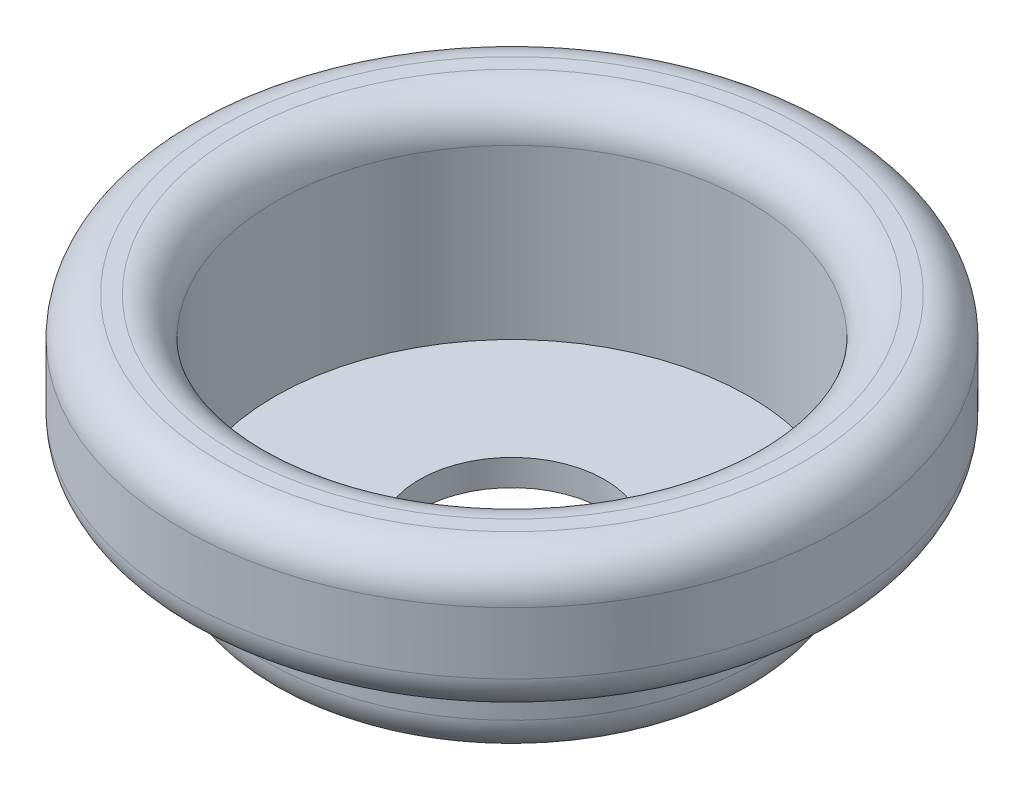
ISO-10303-21;
HEADER;
FILE_DESCRIPTION(('STEP AP214'),'2;1');
FILE_NAME('part.step','',(''),(''),'','','');
FILE_SCHEMA(('AUTOMOTIVE_DESIGN { 1 0 10303 214 1 1 1 1 }'));
ENDSEC;
DATA;
#1=APPLICATION_CONTEXT('core data for automotive mechanical design processes');
#2=APPLICATION_PROTOCOL_DEFINITION('international standard','automotive_design',2000,#1);
#3=PRODUCT_CONTEXT('',#1,'mechanical');
#4=PRODUCT('Part','Part','',(#3));
#5=PRODUCT_RELATED_PRODUCT_CATEGORY('part','',(#4));
#6=PRODUCT_DEFINITION_FORMATION('','',#4);
#7=PRODUCT_DEFINITION_CONTEXT('part definition',#1,'design');
#8=PRODUCT_DEFINITION('design','',#6,#7);
#9=PRODUCT_DEFINITION_SHAPE('','',#8);
#10=(LENGTH_UNIT() NAMED_UNIT(*) SI_UNIT(.MILLI.,.METRE.));
#11=(NAMED_UNIT(*) PLANE_ANGLE_UNIT() SI_UNIT($,.RADIAN.));
#12=(NAMED_UNIT(*) SI_UNIT($,.STERADIAN.) SOLID_ANGLE_UNIT());
#13=UNCERTAINTY_MEASURE_WITH_UNIT(LENGTH_MEASURE(1.E-05),#10,'distance_accuracy_value','');
#14=(GEOMETRIC_REPRESENTATION_CONTEXT(3) GLOBAL_UNCERTAINTY_ASSIGNED_CONTEXT((#13)) GLOBAL_UNIT_ASSIGNED_CONTEXT((#10,
#11,#12)) REPRESENTATION_CONTEXT('',''));
#15=CARTESIAN_POINT('',(0.,0.,0.));
#16=DIRECTION('',(0.,0.,1.));
#17=DIRECTION('',(1.,0.,0.));
#18=AXIS2_PLACEMENT_3D('',#15,#16,#17);
#19=CARTESIAN_POINT('',(0.,0.,0.));
#20=DIRECTION('',(0.,-1.,0.));
#21=DIRECTION('',(0.,0.,-1.));
#22=AXIS2_PLACEMENT_3D('',#19,#20,#21);
#23=CYLINDRICAL_SURFACE('',#22,4.064);
#24=CARTESIAN_POINT('',(0.,0.635,0.));
#25=DIRECTION('',(0.,1.,0.));
#26=DIRECTION('',(0.,0.,1.));
#27=AXIS2_PLACEMENT_3D('',#24,#25,#26);
#28=CIRCLE('',#27,4.064);
#29=CARTESIAN_POINT('',(0.,0.635,4.064));
#30=VERTEX_POINT('',#29);
#31=EDGE_CURVE('E59',#30,#30,#28,.T.);
#32=ORIENTED_EDGE('',*,*,#31,.T.);
#33=EDGE_LOOP('',(#32));
#34=FACE_BOUND('',#33,.T.);
#35=CARTESIAN_POINT('',(0.,0.914399999999999,0.));
#36=DIRECTION('',(0.,1.,0.));
#37=DIRECTION('',(0.,0.,1.));
#38=AXIS2_PLACEMENT_3D('',#35,#36,#37);
#39=CIRCLE('',#38,4.064);
#40=CARTESIAN_POINT('',(0.,0.914399999999999,4.064));
#41=VERTEX_POINT('',#40);
#42=EDGE_CURVE('E62',#41,#41,#39,.F.);
#43=ORIENTED_EDGE('',*,*,#42,.T.);
#44=EDGE_LOOP('',(#43));
#45=FACE_BOUND('',#44,.T.);
#46=ADVANCED_FACE('F30',(#34,#45),#23,.T.);
#47=CARTESIAN_POINT('',(-4.064,0.,0.));
#48=DIRECTION('',(0.,1.,0.));
#49=DIRECTION('',(0.,0.,1.));
#50=AXIS2_PLACEMENT_3D('',#47,#48,#49);
#51=PLANE('',#50);
#52=CARTESIAN_POINT('',(0.,0.,0.));
#53=DIRECTION('',(0.,1.,0.));
#54=DIRECTION('',(0.,0.,1.));
#55=AXIS2_PLACEMENT_3D('',#52,#53,#54);
#56=CIRCLE('',#55,3.429);
#57=CARTESIAN_POINT('',(0.,0.,3.429));
#58=VERTEX_POINT('',#57);
#59=EDGE_CURVE('E65',#58,#58,#56,.F.);
#60=ORIENTED_EDGE('',*,*,#59,.T.);
#61=EDGE_LOOP('',(#60));
#62=FACE_BOUND('',#61,.T.);
#63=CARTESIAN_POINT('',(0.,0.,0.));
#64=DIRECTION('',(0.,-1.,0.));
#65=DIRECTION('',(0.,0.,-1.));
#66=AXIS2_PLACEMENT_3D('',#63,#64,#65);
#67=CIRCLE('',#66,1.524);
#68=CARTESIAN_POINT('',(0.,0.,-1.524));
#69=VERTEX_POINT('',#68);
#70=EDGE_CURVE('E68',#69,#69,#67,.T.);
#71=ORIENTED_EDGE('',*,*,#70,.F.);
#72=EDGE_LOOP('',(#71));
#73=FACE_BOUND('',#72,.T.);
#74=ADVANCED_FACE('F89',(#62,#73),#51,.F.);
#75=CARTESIAN_POINT('',(0.,0.,0.));
#76=DIRECTION('',(0.,-1.,0.));
#77=DIRECTION('',(0.,0.,-1.));
#78=AXIS2_PLACEMENT_3D('',#75,#76,#77);
#79=CYLINDRICAL_SURFACE('',#78,1.524);
#80=CARTESIAN_POINT('',(0.,0.431799999999999,0.));
#81=DIRECTION('',(0.,-1.,0.));
#82=DIRECTION('',(0.,0.,-1.));
#83=AXIS2_PLACEMENT_3D('',#80,#81,#82);
#84=CIRCLE('',#83,1.524);
#85=CARTESIAN_POINT('',(0.,0.431799999999999,-1.524));
#86=VERTEX_POINT('',#85);
#87=EDGE_CURVE('E71',#86,#86,#84,.T.);
#88=ORIENTED_EDGE('',*,*,#87,.F.);
#89=EDGE_LOOP('',(#88));
#90=FACE_BOUND('',#89,.T.);
#91=ORIENTED_EDGE('',*,*,#70,.T.);
#92=EDGE_LOOP('',(#91));
#93=FACE_BOUND('',#92,.T.);
#94=ADVANCED_FACE('F83',(#90,#93),#79,.F.);
#95=CARTESIAN_POINT('',(-1.524,0.431799999999999,0.));
#96=DIRECTION('',(0.,-1.,0.));
#97=DIRECTION('',(0.,0.,-1.));
#98=AXIS2_PLACEMENT_3D('',#95,#96,#97);
#99=PLANE('',#98);
#100=CARTESIAN_POINT('',(0.,0.431799999999999,0.));
#101=DIRECTION('',(0.,-1.,0.));
#102=DIRECTION('',(0.,0.,-1.));
#103=AXIS2_PLACEMENT_3D('',#100,#101,#102);
#104=CIRCLE('',#103,3.8989);
#105=CARTESIAN_POINT('',(0.,0.431799999999999,-3.8989));
#106=VERTEX_POINT('',#105);
#107=EDGE_CURVE('E74',#106,#106,#104,.T.);
#108=ORIENTED_EDGE('',*,*,#107,.F.);
#109=EDGE_LOOP('',(#108));
#110=FACE_BOUND('',#109,.T.);
#111=ORIENTED_EDGE('',*,*,#87,.T.);
#112=EDGE_LOOP('',(#111));
#113=FACE_BOUND('',#112,.T.);
#114=ADVANCED_FACE('F80',(#110,#113),#99,.F.);
#115=CARTESIAN_POINT('',(0.,0.,0.));
#116=DIRECTION('',(0.,-1.,0.));
#117=DIRECTION('',(0.,0.,-1.));
#118=AXIS2_PLACEMENT_3D('',#115,#116,#117);
#119=CYLINDRICAL_SURFACE('',#118,3.8989);
#120=CARTESIAN_POINT('',(0.,3.2004,0.));
#121=DIRECTION('',(0.,-1.,0.));
#122=DIRECTION('',(0.,0.,-1.));
#123=AXIS2_PLACEMENT_3D('',#120,#121,#122);
#124=CIRCLE('',#123,3.8989);
#125=CARTESIAN_POINT('',(0.,3.2004,-3.8989));
#126=VERTEX_POINT('',#125);
#127=EDGE_CURVE('E10',#126,#126,#124,.F.);
#128=ORIENTED_EDGE('',*,*,#127,.T.);
#129=EDGE_LOOP('',(#128));
#130=FACE_BOUND('',#129,.T.);
#131=ORIENTED_EDGE('',*,*,#107,.T.);
#132=EDGE_LOOP('',(#131));
#133=FACE_BOUND('',#132,.T.);
#134=ADVANCED_FACE('F78',(#130,#133),#119,.F.);
#135=CARTESIAN_POINT('',(-3.8989,3.8354,0.));
#136=DIRECTION('',(0.,-1.,0.));
#137=DIRECTION('',(0.,0.,-1.));
#138=AXIS2_PLACEMENT_3D('',#135,#136,#137);
#139=PLANE('',#138);
#140=CARTESIAN_POINT('',(0.,3.8354,0.));
#141=DIRECTION('',(0.,-1.,0.));
#142=DIRECTION('',(0.,0.,-1.));
#143=AXIS2_PLACEMENT_3D('',#140,#141,#142);
#144=CIRCLE('',#143,4.7879);
#145=CARTESIAN_POINT('',(0.,3.8354,-4.7879));
#146=VERTEX_POINT('',#145);
#147=EDGE_CURVE('E37',#146,#146,#144,.F.);
#148=ORIENTED_EDGE('',*,*,#147,.T.);
#149=EDGE_LOOP('',(#148));
#150=FACE_BOUND('',#149,.T.);
#151=CARTESIAN_POINT('',(0.,3.8354,0.));
#152=DIRECTION('',(0.,-1.,0.));
#153=DIRECTION('',(0.,0.,-1.));
#154=AXIS2_PLACEMENT_3D('',#151,#152,#153);
#155=CIRCLE('',#154,4.5339);
#156=CARTESIAN_POINT('',(0.,3.8354,-4.5339));
#157=VERTEX_POINT('',#156);
#158=EDGE_CURVE('E41',#157,#157,#155,.T.);
#159=ORIENTED_EDGE('',*,*,#158,.T.);
#160=EDGE_LOOP('',(#159));
#161=FACE_BOUND('',#160,.T.);
#162=ADVANCED_FACE('F126',(#150,#161),#139,.F.);
#163=CARTESIAN_POINT('',(0.,0.,0.));
#164=DIRECTION('',(0.,-1.,0.));
#165=DIRECTION('',(0.,0.,-1.));
#166=AXIS2_PLACEMENT_3D('',#163,#164,#165);
#167=CYLINDRICAL_SURFACE('',#166,5.4229);
#168=CARTESIAN_POINT('',(0.,2.1844,0.));
#169=DIRECTION('',(0.,1.,0.));
#170=DIRECTION('',(0.,0.,1.));
#171=AXIS2_PLACEMENT_3D('',#168,#169,#170);
#172=CIRCLE('',#171,5.4229);
#173=CARTESIAN_POINT('',(0.,2.1844,5.4229));
#174=VERTEX_POINT('',#173);
#175=EDGE_CURVE('E45',#174,#174,#172,.T.);
#176=ORIENTED_EDGE('',*,*,#175,.T.);
#177=EDGE_LOOP('',(#176));
#178=FACE_BOUND('',#177,.T.);
#179=CARTESIAN_POINT('',(0.,3.2004,0.));
#180=DIRECTION('',(0.,-1.,0.));
#181=DIRECTION('',(0.,0.,-1.));
#182=AXIS2_PLACEMENT_3D('',#179,#180,#181);
#183=CIRCLE('',#182,5.4229);
#184=CARTESIAN_POINT('',(0.,3.2004,-5.4229));
#185=VERTEX_POINT('',#184);
#186=EDGE_CURVE('E50',#185,#185,#183,.T.);
#187=ORIENTED_EDGE('',*,*,#186,.T.);
#188=EDGE_LOOP('',(#187));
#189=FACE_BOUND('',#188,.T.);
#190=ADVANCED_FACE('F124',(#178,#189),#167,.T.);
#191=CARTESIAN_POINT('',(-5.4229,1.5494,0.));
#192=DIRECTION('',(0.,1.,0.));
#193=DIRECTION('',(0.,0.,1.));
#194=AXIS2_PLACEMENT_3D('',#191,#192,#193);
#195=PLANE('',#194);
#196=CARTESIAN_POINT('',(0.,1.5494,0.));
#197=DIRECTION('',(0.,1.,0.));
#198=DIRECTION('',(0.,0.,1.));
#199=AXIS2_PLACEMENT_3D('',#196,#197,#198);
#200=CIRCLE('',#199,4.699);
#201=CARTESIAN_POINT('',(0.,1.5494,4.699));
#202=VERTEX_POINT('',#201);
#203=EDGE_CURVE('E53',#202,#202,#200,.T.);
#204=ORIENTED_EDGE('',*,*,#203,.T.);
#205=EDGE_LOOP('',(#204));
#206=FACE_BOUND('',#205,.T.);
#207=CARTESIAN_POINT('',(0.,1.5494,0.));
#208=DIRECTION('',(0.,1.,0.));
#209=DIRECTION('',(0.,0.,1.));
#210=AXIS2_PLACEMENT_3D('',#207,#208,#209);
#211=CIRCLE('',#210,4.7879);
#212=CARTESIAN_POINT('',(0.,1.5494,4.7879));
#213=VERTEX_POINT('',#212);
#214=EDGE_CURVE('E56',#213,#213,#211,.F.);
#215=ORIENTED_EDGE('',*,*,#214,.T.);
#216=EDGE_LOOP('',(#215));
#217=FACE_BOUND('',#216,.T.);
#218=ADVANCED_FACE('F106',(#206,#217),#195,.F.);
#219=CARTESIAN_POINT('',(0.,0.635,0.));
#220=DIRECTION('',(0.,1.,0.));
#221=DIRECTION('',(0.,0.,1.));
#222=AXIS2_PLACEMENT_3D('',#219,#220,#221);
#223=TOROIDAL_SURFACE('',#222,3.429,0.635);
#224=ORIENTED_EDGE('',*,*,#31,.F.);
#225=EDGE_LOOP('',(#224));
#226=FACE_BOUND('',#225,.T.);
#227=ORIENTED_EDGE('',*,*,#59,.F.);
#228=EDGE_LOOP('',(#227));
#229=FACE_BOUND('',#228,.T.);
#230=ADVANCED_FACE('F102',(#226,#229),#223,.T.);
#231=CARTESIAN_POINT('',(0.,0.914399999999999,0.));
#232=DIRECTION('',(0.,1.,0.));
#233=DIRECTION('',(0.,0.,1.));
#234=AXIS2_PLACEMENT_3D('',#231,#232,#233);
#235=TOROIDAL_SURFACE('',#234,4.699,0.635);
#236=ORIENTED_EDGE('',*,*,#203,.F.);
#237=EDGE_LOOP('',(#236));
#238=FACE_BOUND('',#237,.T.);
#239=ORIENTED_EDGE('',*,*,#42,.F.);
#240=EDGE_LOOP('',(#239));
#241=FACE_BOUND('',#240,.T.);
#242=ADVANCED_FACE('F105',(#238,#241),#235,.F.);
#243=CARTESIAN_POINT('',(0.,2.1844,0.));
#244=DIRECTION('',(0.,1.,0.));
#245=DIRECTION('',(0.,0.,1.));
#246=AXIS2_PLACEMENT_3D('',#243,#244,#245);
#247=TOROIDAL_SURFACE('',#246,4.7879,0.635);
#248=ORIENTED_EDGE('',*,*,#175,.F.);
#249=EDGE_LOOP('',(#248));
#250=FACE_BOUND('',#249,.T.);
#251=ORIENTED_EDGE('',*,*,#214,.F.);
#252=EDGE_LOOP('',(#251));
#253=FACE_BOUND('',#252,.T.);
#254=ADVANCED_FACE('F110',(#250,#253),#247,.T.);
#255=CARTESIAN_POINT('',(0.,3.2004,0.));
#256=DIRECTION('',(0.,-1.,0.));
#257=DIRECTION('',(0.,0.,-1.));
#258=AXIS2_PLACEMENT_3D('',#255,#256,#257);
#259=TOROIDAL_SURFACE('',#258,4.7879,0.635);
#260=ORIENTED_EDGE('',*,*,#147,.F.);
#261=EDGE_LOOP('',(#260));
#262=FACE_BOUND('',#261,.T.);
#263=ORIENTED_EDGE('',*,*,#186,.F.);
#264=EDGE_LOOP('',(#263));
#265=FACE_BOUND('',#264,.T.);
#266=ADVANCED_FACE('F113',(#262,#265),#259,.T.);
#267=CARTESIAN_POINT('',(0.,3.2004,0.));
#268=DIRECTION('',(0.,-1.,0.));
#269=DIRECTION('',(0.,0.,-1.));
#270=AXIS2_PLACEMENT_3D('',#267,#268,#269);
#271=TOROIDAL_SURFACE('',#270,4.5339,0.635);
#272=ORIENTED_EDGE('',*,*,#127,.F.);
#273=EDGE_LOOP('',(#272));
#274=FACE_BOUND('',#273,.T.);
#275=ORIENTED_EDGE('',*,*,#158,.F.);
#276=EDGE_LOOP('',(#275));
#277=FACE_BOUND('',#276,.T.);
#278=ADVANCED_FACE('F32',(#274,#277),#271,.T.);
#279=CLOSED_SHELL('',(#46,#74,#94,#114,#134,#162,#190,#218,#230,#242,#254,#266,#278));
#280=MANIFOLD_SOLID_BREP('B2',#279);
#281=ADVANCED_BREP_SHAPE_REPRESENTATION('',(#18,#280),#14);
#282=SHAPE_DEFINITION_REPRESENTATION(#9,#281);
ENDSEC;
END-ISO-10303-21;
